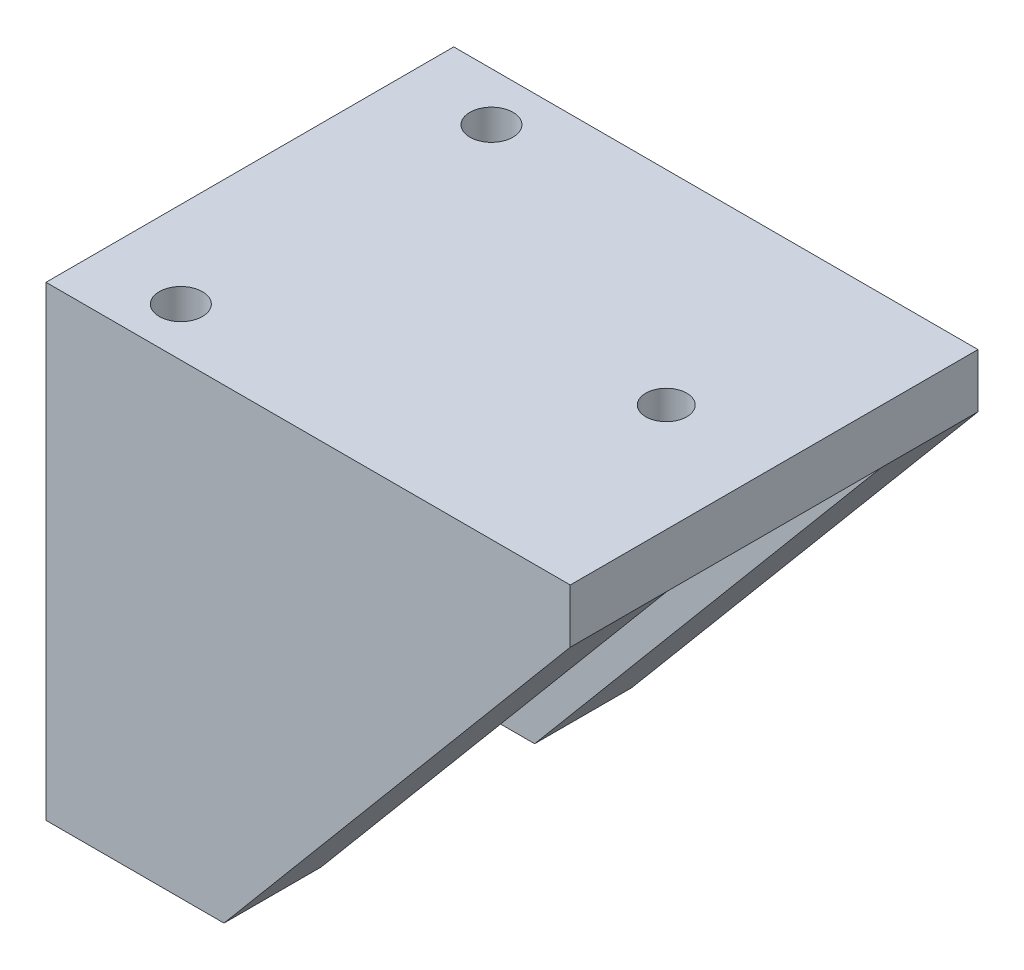
ISO-10303-21;
HEADER;
FILE_DESCRIPTION(('STEP AP214'),'2;1');
FILE_NAME('part.step','',(''),(''),'','','');
FILE_SCHEMA(('AUTOMOTIVE_DESIGN { 1 0 10303 214 1 1 1 1 }'));
ENDSEC;
DATA;
#1=APPLICATION_CONTEXT('core data for automotive mechanical design processes');
#2=APPLICATION_PROTOCOL_DEFINITION('international standard','automotive_design',2000,#1);
#3=PRODUCT_CONTEXT('',#1,'mechanical');
#4=PRODUCT('Part','Part','',(#3));
#5=PRODUCT_RELATED_PRODUCT_CATEGORY('part','',(#4));
#6=PRODUCT_DEFINITION_FORMATION('','',#4);
#7=PRODUCT_DEFINITION_CONTEXT('part definition',#1,'design');
#8=PRODUCT_DEFINITION('design','',#6,#7);
#9=PRODUCT_DEFINITION_SHAPE('','',#8);
#10=(LENGTH_UNIT() NAMED_UNIT(*) SI_UNIT(.MILLI.,.METRE.));
#11=(NAMED_UNIT(*) PLANE_ANGLE_UNIT() SI_UNIT($,.RADIAN.));
#12=(NAMED_UNIT(*) SI_UNIT($,.STERADIAN.) SOLID_ANGLE_UNIT());
#13=UNCERTAINTY_MEASURE_WITH_UNIT(LENGTH_MEASURE(1.E-05),#10,'distance_accuracy_value','');
#14=(GEOMETRIC_REPRESENTATION_CONTEXT(3) GLOBAL_UNCERTAINTY_ASSIGNED_CONTEXT((#13)) GLOBAL_UNIT_ASSIGNED_CONTEXT((#10,
#11,#12)) REPRESENTATION_CONTEXT('',''));
#15=CARTESIAN_POINT('',(0.,0.,0.));
#16=DIRECTION('',(0.,0.,1.));
#17=DIRECTION('',(1.,0.,0.));
#18=AXIS2_PLACEMENT_3D('',#15,#16,#17);
#19=CARTESIAN_POINT('',(-48.6730965518551,-8.5,28.8));
#20=DIRECTION('',(0.,1.,0.));
#21=DIRECTION('',(0.,0.,1.));
#22=AXIS2_PLACEMENT_3D('',#19,#20,#21);
#23=PLANE('',#22);
#24=CARTESIAN_POINT('',(-40.6730965518551,-8.5,-4.49576462355147));
#25=DIRECTION('',(0.,-1.,0.));
#26=DIRECTION('',(0.,0.,-1.));
#27=AXIS2_PLACEMENT_3D('',#24,#25,#26);
#28=CIRCLE('',#27,2.);
#29=CARTESIAN_POINT('',(-40.6730965518551,-8.5,-6.49576462355148));
#30=VERTEX_POINT('',#29);
#31=EDGE_CURVE('E254',#30,#30,#28,.T.);
#32=ORIENTED_EDGE('',*,*,#31,.F.);
#33=EDGE_LOOP('',(#32));
#34=FACE_BOUND('',#33,.T.);
#35=DIRECTION('',(-1.,0.,0.));
#36=VECTOR('',#35,1.);
#37=CARTESIAN_POINT('',(-32.1730965518551,-8.5,0.));
#38=LINE('',#37,#36);
#39=CARTESIAN_POINT('',(-32.1730965518551,-8.5,0.));
#40=VERTEX_POINT('',#39);
#41=CARTESIAN_POINT('',(-48.6730965518551,-8.5,0.));
#42=VERTEX_POINT('',#41);
#43=EDGE_CURVE('E124',#40,#42,#38,.T.);
#44=ORIENTED_EDGE('',*,*,#43,.T.);
#45=DIRECTION('',(0.,0.,-1.));
#46=VECTOR('',#45,1.);
#47=CARTESIAN_POINT('',(-48.6730965518551,-8.5,28.8));
#48=LINE('',#47,#46);
#49=CARTESIAN_POINT('',(-48.6730965518551,-8.5,-9.));
#50=VERTEX_POINT('',#49);
#51=EDGE_CURVE('E134',#42,#50,#48,.T.);
#52=ORIENTED_EDGE('',*,*,#51,.T.);
#53=DIRECTION('',(-1.,0.,0.));
#54=VECTOR('',#53,1.);
#55=CARTESIAN_POINT('',(-32.1730965518551,-8.5,-9.));
#56=LINE('',#55,#54);
#57=CARTESIAN_POINT('',(-32.1730965518551,-8.5,-9.));
#58=VERTEX_POINT('',#57);
#59=EDGE_CURVE('E224',#58,#50,#56,.T.);
#60=ORIENTED_EDGE('',*,*,#59,.F.);
#61=DIRECTION('',(0.,0.,1.));
#62=VECTOR('',#61,1.);
#63=CARTESIAN_POINT('',(-32.1730965518551,-8.5,-9.));
#64=LINE('',#63,#62);
#65=EDGE_CURVE('E137',#58,#40,#64,.T.);
#66=ORIENTED_EDGE('',*,*,#65,.T.);
#67=EDGE_LOOP('',(#44,#52,#60,#66));
#68=FACE_BOUND('',#67,.T.);
#69=ADVANCED_FACE('F34',(#34,#68),#23,.F.);
#70=CARTESIAN_POINT('',(0.,0.,19.8));
#71=DIRECTION('',(0.,0.,1.));
#72=DIRECTION('',(1.,0.,0.));
#73=AXIS2_PLACEMENT_3D('',#70,#71,#72);
#74=PLANE('',#73);
#75=DIRECTION('',(1.,0.,0.));
#76=VECTOR('',#75,1.);
#77=CARTESIAN_POINT('',(-48.6730965518551,-8.5,19.8));
#78=LINE('',#77,#76);
#79=CARTESIAN_POINT('',(-48.6730965518551,-8.5,19.8));
#80=VERTEX_POINT('',#79);
#81=CARTESIAN_POINT('',(-32.1730965518551,-8.5,19.8));
#82=VERTEX_POINT('',#81);
#83=EDGE_CURVE('E192',#80,#82,#78,.T.);
#84=ORIENTED_EDGE('',*,*,#83,.F.);
#85=DIRECTION('',(0.,-1.,0.));
#86=VECTOR('',#85,1.);
#87=CARTESIAN_POINT('',(-48.6730965518551,34.7,19.8));
#88=LINE('',#87,#86);
#89=CARTESIAN_POINT('',(-48.6730965518551,2.79999999999999,19.8));
#90=VERTEX_POINT('',#89);
#91=EDGE_CURVE('E190',#90,#80,#88,.T.);
#92=ORIENTED_EDGE('',*,*,#91,.F.);
#93=DIRECTION('',(1.,0.,0.));
#94=VECTOR('',#93,1.);
#95=CARTESIAN_POINT('',(-48.6730965518551,2.79999999999999,19.8));
#96=LINE('',#95,#94);
#97=CARTESIAN_POINT('',(-40.6730965518551,2.79999999999999,19.8));
#98=VERTEX_POINT('',#97);
#99=EDGE_CURVE('E152',#90,#98,#96,.T.);
#100=ORIENTED_EDGE('',*,*,#99,.T.);
#101=DIRECTION('',(0.,1.,0.));
#102=VECTOR('',#101,1.);
#103=CARTESIAN_POINT('',(-40.6730965518551,29.7,19.8));
#104=LINE('',#103,#102);
#105=CARTESIAN_POINT('',(-40.6730965518551,29.7,19.8));
#106=VERTEX_POINT('',#105);
#107=EDGE_CURVE('E155',#98,#106,#104,.T.);
#108=ORIENTED_EDGE('',*,*,#107,.T.);
#109=DIRECTION('',(1.,0.,0.));
#110=VECTOR('',#109,1.);
#111=CARTESIAN_POINT('',(-40.6730965518551,29.7,19.8));
#112=LINE('',#111,#110);
#113=CARTESIAN_POINT('',(-0.0730965518550564,29.7,19.8));
#114=VERTEX_POINT('',#113);
#115=EDGE_CURVE('E159',#106,#114,#112,.T.);
#116=ORIENTED_EDGE('',*,*,#115,.T.);
#117=DIRECTION('',(0.6433330806464,0.765586407498208,0.));
#118=VECTOR('',#117,1.);
#119=CARTESIAN_POINT('',(-0.0730965518550564,29.7,19.8));
#120=LINE('',#119,#118);
#121=EDGE_CURVE('E196',#82,#114,#120,.T.);
#122=ORIENTED_EDGE('',*,*,#121,.F.);
#123=EDGE_LOOP('',(#84,#92,#100,#108,#116,#122));
#124=FACE_BOUND('',#123,.T.);
#125=ADVANCED_FACE('F188',(#124),#74,.F.);
#126=CARTESIAN_POINT('',(-48.6730965518551,2.79999999999999,19.8));
#127=DIRECTION('',(1.,0.,0.));
#128=DIRECTION('',(0.,0.,-1.));
#129=AXIS2_PLACEMENT_3D('',#126,#127,#128);
#130=PLANE('',#129);
#131=ORIENTED_EDGE('',*,*,#51,.F.);
#132=DIRECTION('',(0.,1.,0.));
#133=VECTOR('',#132,1.);
#134=CARTESIAN_POINT('',(-48.6730965518551,-8.5,0.));
#135=LINE('',#134,#133);
#136=CARTESIAN_POINT('',(-48.6730965518551,2.79999999999999,0.));
#137=VERTEX_POINT('',#136);
#138=EDGE_CURVE('E120',#42,#137,#135,.T.);
#139=ORIENTED_EDGE('',*,*,#138,.T.);
#140=DIRECTION('',(0.,0.,-1.));
#141=VECTOR('',#140,1.);
#142=CARTESIAN_POINT('',(-48.6730965518551,2.79999999999999,19.8));
#143=LINE('',#142,#141);
#144=EDGE_CURVE('E174',#90,#137,#143,.T.);
#145=ORIENTED_EDGE('',*,*,#144,.F.);
#146=ORIENTED_EDGE('',*,*,#91,.T.);
#147=CARTESIAN_POINT('',(-48.6730965518551,-8.5,28.8));
#148=VERTEX_POINT('',#147);
#149=EDGE_CURVE('E143',#148,#80,#48,.T.);
#150=ORIENTED_EDGE('',*,*,#149,.F.);
#151=DIRECTION('',(0.,-1.,0.));
#152=VECTOR('',#151,1.);
#153=CARTESIAN_POINT('',(-48.6730965518551,34.7,28.8));
#154=LINE('',#153,#152);
#155=CARTESIAN_POINT('',(-48.6730965518551,34.7,28.8));
#156=VERTEX_POINT('',#155);
#157=EDGE_CURVE('E204',#156,#148,#154,.T.);
#158=ORIENTED_EDGE('',*,*,#157,.F.);
#159=DIRECTION('',(0.,0.,-1.));
#160=VECTOR('',#159,1.);
#161=CARTESIAN_POINT('',(-48.6730965518551,34.7,19.8));
#162=LINE('',#161,#160);
#163=CARTESIAN_POINT('',(-48.6730965518551,34.7,-9.));
#164=VERTEX_POINT('',#163);
#165=EDGE_CURVE('E176',#156,#164,#162,.T.);
#166=ORIENTED_EDGE('',*,*,#165,.T.);
#167=DIRECTION('',(0.,1.,0.));
#168=VECTOR('',#167,1.);
#169=CARTESIAN_POINT('',(-48.6730965518551,-8.5,-9.));
#170=LINE('',#169,#168);
#171=EDGE_CURVE('E141',#50,#164,#170,.T.);
#172=ORIENTED_EDGE('',*,*,#171,.F.);
#173=EDGE_LOOP('',(#131,#139,#145,#146,#150,#158,#166,#172));
#174=FACE_BOUND('',#173,.T.);
#175=ADVANCED_FACE('F36',(#174),#130,.F.);
#176=CARTESIAN_POINT('',(-48.6730965518551,2.79999999999999,19.8));
#177=DIRECTION('',(0.,1.,0.));
#178=DIRECTION('',(0.,0.,1.));
#179=AXIS2_PLACEMENT_3D('',#176,#177,#178);
#180=PLANE('',#179);
#181=CARTESIAN_POINT('',(-45.2730965518551,2.79999999999999,4.9));
#182=DIRECTION('',(0.,1.,0.));
#183=DIRECTION('',(0.,0.,1.));
#184=AXIS2_PLACEMENT_3D('',#181,#182,#183);
#185=CIRCLE('',#184,2.15);
#186=CARTESIAN_POINT('',(-45.2730965518551,2.79999999999999,7.05));
#187=VERTEX_POINT('',#186);
#188=EDGE_CURVE('E11',#187,#187,#185,.F.);
#189=ORIENTED_EDGE('',*,*,#188,.F.);
#190=EDGE_LOOP('',(#189));
#191=FACE_BOUND('',#190,.T.);
#192=CARTESIAN_POINT('',(-45.2730965518551,2.79999999999999,14.9));
#193=DIRECTION('',(0.,1.,0.));
#194=DIRECTION('',(0.,0.,1.));
#195=AXIS2_PLACEMENT_3D('',#192,#193,#194);
#196=CIRCLE('',#195,2.15);
#197=CARTESIAN_POINT('',(-45.2730965518551,2.79999999999999,17.05));
#198=VERTEX_POINT('',#197);
#199=EDGE_CURVE('E42',#198,#198,#196,.F.);
#200=ORIENTED_EDGE('',*,*,#199,.F.);
#201=EDGE_LOOP('',(#200));
#202=FACE_BOUND('',#201,.T.);
#203=DIRECTION('',(1.,0.,0.));
#204=VECTOR('',#203,1.);
#205=CARTESIAN_POINT('',(-48.6730965518551,2.79999999999999,0.));
#206=LINE('',#205,#204);
#207=CARTESIAN_POINT('',(-40.6730965518551,2.79999999999999,0.));
#208=VERTEX_POINT('',#207);
#209=EDGE_CURVE('E125',#137,#208,#206,.T.);
#210=ORIENTED_EDGE('',*,*,#209,.T.);
#211=DIRECTION('',(0.,0.,-1.));
#212=VECTOR('',#211,1.);
#213=CARTESIAN_POINT('',(-40.6730965518551,2.79999999999999,19.8));
#214=LINE('',#213,#212);
#215=EDGE_CURVE('E57',#98,#208,#214,.T.);
#216=ORIENTED_EDGE('',*,*,#215,.F.);
#217=ORIENTED_EDGE('',*,*,#99,.F.);
#218=ORIENTED_EDGE('',*,*,#144,.T.);
#219=EDGE_LOOP('',(#210,#216,#217,#218));
#220=FACE_BOUND('',#219,.T.);
#221=ADVANCED_FACE('F182',(#191,#202,#220),#180,.F.);
#222=CARTESIAN_POINT('',(-40.6730965518551,29.7,19.8));
#223=DIRECTION('',(-1.,0.,0.));
#224=DIRECTION('',(0.,0.,1.));
#225=AXIS2_PLACEMENT_3D('',#222,#223,#224);
#226=PLANE('',#225);
#227=DIRECTION('',(0.,1.,0.));
#228=VECTOR('',#227,1.);
#229=CARTESIAN_POINT('',(-40.6730965518551,29.7,0.));
#230=LINE('',#229,#228);
#231=CARTESIAN_POINT('',(-40.6730965518551,29.7,0.));
#232=VERTEX_POINT('',#231);
#233=EDGE_CURVE('E164',#208,#232,#230,.T.);
#234=ORIENTED_EDGE('',*,*,#233,.T.);
#235=DIRECTION('',(0.,0.,-1.));
#236=VECTOR('',#235,1.);
#237=CARTESIAN_POINT('',(-40.6730965518551,29.7,19.8));
#238=LINE('',#237,#236);
#239=EDGE_CURVE('E49',#106,#232,#238,.T.);
#240=ORIENTED_EDGE('',*,*,#239,.F.);
#241=ORIENTED_EDGE('',*,*,#107,.F.);
#242=ORIENTED_EDGE('',*,*,#215,.T.);
#243=EDGE_LOOP('',(#234,#240,#241,#242));
#244=FACE_BOUND('',#243,.T.);
#245=ADVANCED_FACE('F184',(#244),#226,.F.);
#246=CARTESIAN_POINT('',(-40.6730965518551,29.7,19.8));
#247=DIRECTION('',(0.,1.,0.));
#248=DIRECTION('',(0.,0.,1.));
#249=AXIS2_PLACEMENT_3D('',#246,#247,#248);
#250=PLANE('',#249);
#251=CARTESIAN_POINT('',(-10.0730965518551,29.7,9.9));
#252=DIRECTION('',(0.,1.,0.));
#253=DIRECTION('',(0.,0.,1.));
#254=AXIS2_PLACEMENT_3D('',#251,#252,#253);
#255=CIRCLE('',#254,1.9);
#256=CARTESIAN_POINT('',(-10.0730965518551,29.7,11.8));
#257=VERTEX_POINT('',#256);
#258=EDGE_CURVE('E138',#257,#257,#255,.F.);
#259=ORIENTED_EDGE('',*,*,#258,.F.);
#260=EDGE_LOOP('',(#259));
#261=FACE_BOUND('',#260,.T.);
#262=DIRECTION('',(1.,0.,0.));
#263=VECTOR('',#262,1.);
#264=CARTESIAN_POINT('',(-40.6730965518551,29.7,0.));
#265=LINE('',#264,#263);
#266=CARTESIAN_POINT('',(-0.0730965518550564,29.7,0.));
#267=VERTEX_POINT('',#266);
#268=EDGE_CURVE('E156',#232,#267,#265,.T.);
#269=ORIENTED_EDGE('',*,*,#268,.T.);
#270=DIRECTION('',(0.,0.,-1.));
#271=VECTOR('',#270,1.);
#272=CARTESIAN_POINT('',(-0.0730965518550564,29.7,19.8));
#273=LINE('',#272,#271);
#274=EDGE_CURVE('E169',#114,#267,#273,.T.);
#275=ORIENTED_EDGE('',*,*,#274,.F.);
#276=ORIENTED_EDGE('',*,*,#115,.F.);
#277=ORIENTED_EDGE('',*,*,#239,.T.);
#278=EDGE_LOOP('',(#269,#275,#276,#277));
#279=FACE_BOUND('',#278,.T.);
#280=ADVANCED_FACE('F296',(#261,#279),#250,.F.);
#281=CARTESIAN_POINT('',(-0.0730965518550564,34.7,19.8));
#282=DIRECTION('',(-1.,0.,0.));
#283=DIRECTION('',(0.,0.,1.));
#284=AXIS2_PLACEMENT_3D('',#281,#282,#283);
#285=PLANE('',#284);
#286=ORIENTED_EDGE('',*,*,#274,.T.);
#287=DIRECTION('',(0.,0.,1.));
#288=VECTOR('',#287,1.);
#289=CARTESIAN_POINT('',(-0.0730965518550564,29.7,-9.));
#290=LINE('',#289,#288);
#291=CARTESIAN_POINT('',(-0.0730965518550564,29.7,-9.));
#292=VERTEX_POINT('',#291);
#293=EDGE_CURVE('E194',#292,#267,#290,.T.);
#294=ORIENTED_EDGE('',*,*,#293,.F.);
#295=DIRECTION('',(0.,-1.,0.));
#296=VECTOR('',#295,1.);
#297=CARTESIAN_POINT('',(-0.0730965518550564,34.7,-9.));
#298=LINE('',#297,#296);
#299=CARTESIAN_POINT('',(-0.0730965518550564,34.7,-9.));
#300=VERTEX_POINT('',#299);
#301=EDGE_CURVE('E227',#300,#292,#298,.T.);
#302=ORIENTED_EDGE('',*,*,#301,.F.);
#303=DIRECTION('',(0.,0.,-1.));
#304=VECTOR('',#303,1.);
#305=CARTESIAN_POINT('',(-0.0730965518550564,34.7,19.8));
#306=LINE('',#305,#304);
#307=CARTESIAN_POINT('',(-0.0730965518550564,34.7,28.8));
#308=VERTEX_POINT('',#307);
#309=EDGE_CURVE('E162',#308,#300,#306,.T.);
#310=ORIENTED_EDGE('',*,*,#309,.F.);
#311=DIRECTION('',(0.,1.,0.));
#312=VECTOR('',#311,1.);
#313=CARTESIAN_POINT('',(-0.0730965518550564,34.7,28.8));
#314=LINE('',#313,#312);
#315=CARTESIAN_POINT('',(-0.0730965518550564,29.7,28.8));
#316=VERTEX_POINT('',#315);
#317=EDGE_CURVE('E210',#316,#308,#314,.T.);
#318=ORIENTED_EDGE('',*,*,#317,.F.);
#319=DIRECTION('',(0.,0.,-1.));
#320=VECTOR('',#319,1.);
#321=CARTESIAN_POINT('',(-0.0730965518550564,29.7,28.8));
#322=LINE('',#321,#320);
#323=EDGE_CURVE('E148',#316,#114,#322,.T.);
#324=ORIENTED_EDGE('',*,*,#323,.T.);
#325=EDGE_LOOP('',(#286,#294,#302,#310,#318,#324));
#326=FACE_BOUND('',#325,.T.);
#327=ADVANCED_FACE('F280',(#326),#285,.F.);
#328=CARTESIAN_POINT('',(-41.6730965518551,34.7,19.8));
#329=DIRECTION('',(0.,-1.,0.));
#330=DIRECTION('',(0.,0.,-1.));
#331=AXIS2_PLACEMENT_3D('',#328,#329,#330);
#332=PLANE('',#331);
#333=CARTESIAN_POINT('',(-40.6730965518551,34.7,-4.49576462355147));
#334=DIRECTION('',(0.,-1.,0.));
#335=DIRECTION('',(0.,0.,-1.));
#336=AXIS2_PLACEMENT_3D('',#333,#334,#335);
#337=CIRCLE('',#336,2.);
#338=CARTESIAN_POINT('',(-40.6730965518551,34.7,-6.49576462355148));
#339=VERTEX_POINT('',#338);
#340=EDGE_CURVE('E251',#339,#339,#337,.F.);
#341=ORIENTED_EDGE('',*,*,#340,.F.);
#342=EDGE_LOOP('',(#341));
#343=FACE_BOUND('',#342,.T.);
#344=CARTESIAN_POINT('',(-40.6730965518551,34.7,24.3));
#345=DIRECTION('',(0.,-1.,0.));
#346=DIRECTION('',(0.,0.,-1.));
#347=AXIS2_PLACEMENT_3D('',#344,#345,#346);
#348=CIRCLE('',#347,2.);
#349=CARTESIAN_POINT('',(-40.6730965518551,34.7,22.3));
#350=VERTEX_POINT('',#349);
#351=EDGE_CURVE('E245',#350,#350,#348,.F.);
#352=ORIENTED_EDGE('',*,*,#351,.F.);
#353=EDGE_LOOP('',(#352));
#354=FACE_BOUND('',#353,.T.);
#355=CARTESIAN_POINT('',(-10.0730965518551,34.7,9.9));
#356=DIRECTION('',(0.,1.,0.));
#357=DIRECTION('',(0.,0.,1.));
#358=AXIS2_PLACEMENT_3D('',#355,#356,#357);
#359=CIRCLE('',#358,1.9);
#360=CARTESIAN_POINT('',(-10.0730965518551,34.7,11.8));
#361=VERTEX_POINT('',#360);
#362=EDGE_CURVE('E236',#361,#361,#359,.T.);
#363=ORIENTED_EDGE('',*,*,#362,.F.);
#364=EDGE_LOOP('',(#363));
#365=FACE_BOUND('',#364,.T.);
#366=ORIENTED_EDGE('',*,*,#309,.T.);
#367=DIRECTION('',(1.,0.,0.));
#368=VECTOR('',#367,1.);
#369=CARTESIAN_POINT('',(-48.6730965518551,34.7,-9.));
#370=LINE('',#369,#368);
#371=EDGE_CURVE('E229',#164,#300,#370,.T.);
#372=ORIENTED_EDGE('',*,*,#371,.F.);
#373=ORIENTED_EDGE('',*,*,#165,.F.);
#374=DIRECTION('',(-1.,0.,0.));
#375=VECTOR('',#374,1.);
#376=CARTESIAN_POINT('',(-0.0730965518550564,34.7,28.8));
#377=LINE('',#376,#375);
#378=EDGE_CURVE('E200',#308,#156,#377,.T.);
#379=ORIENTED_EDGE('',*,*,#378,.F.);
#380=EDGE_LOOP('',(#366,#372,#373,#379));
#381=FACE_BOUND('',#380,.T.);
#382=ADVANCED_FACE('F272',(#343,#354,#365,#381),#332,.F.);
#383=CARTESIAN_POINT('',(-40.6730965518551,-8.5,24.3));
#384=DIRECTION('',(0.,-1.,0.));
#385=DIRECTION('',(0.,0.,-1.));
#386=AXIS2_PLACEMENT_3D('',#383,#384,#385);
#387=CIRCLE('',#386,2.);
#388=CARTESIAN_POINT('',(-40.6730965518551,-8.5,22.3));
#389=VERTEX_POINT('',#388);
#390=EDGE_CURVE('E248',#389,#389,#387,.T.);
#391=ORIENTED_EDGE('',*,*,#390,.F.);
#392=EDGE_LOOP('',(#391));
#393=FACE_BOUND('',#392,.T.);
#394=ORIENTED_EDGE('',*,*,#149,.T.);
#395=ORIENTED_EDGE('',*,*,#83,.T.);
#396=DIRECTION('',(0.,0.,-1.));
#397=VECTOR('',#396,1.);
#398=CARTESIAN_POINT('',(-32.1730965518551,-8.5,28.8));
#399=LINE('',#398,#397);
#400=CARTESIAN_POINT('',(-32.1730965518551,-8.5,28.8));
#401=VERTEX_POINT('',#400);
#402=EDGE_CURVE('E144',#401,#82,#399,.T.);
#403=ORIENTED_EDGE('',*,*,#402,.F.);
#404=DIRECTION('',(1.,0.,0.));
#405=VECTOR('',#404,1.);
#406=CARTESIAN_POINT('',(-48.6730965518551,-8.5,28.8));
#407=LINE('',#406,#405);
#408=EDGE_CURVE('E217',#148,#401,#407,.T.);
#409=ORIENTED_EDGE('',*,*,#408,.F.);
#410=EDGE_LOOP('',(#394,#395,#403,#409));
#411=FACE_BOUND('',#410,.T.);
#412=ADVANCED_FACE('F263',(#393,#411),#23,.F.);
#413=CARTESIAN_POINT('',(-0.0730965518550564,29.7,28.8));
#414=DIRECTION('',(-0.765586407498208,0.6433330806464,0.));
#415=DIRECTION('',(-0.6433330806464,-0.765586407498208,0.));
#416=AXIS2_PLACEMENT_3D('',#413,#414,#415);
#417=PLANE('',#416);
#418=ORIENTED_EDGE('',*,*,#121,.T.);
#419=ORIENTED_EDGE('',*,*,#323,.F.);
#420=DIRECTION('',(0.6433330806464,0.765586407498208,0.));
#421=VECTOR('',#420,1.);
#422=CARTESIAN_POINT('',(-0.0730965518550564,29.7,28.8));
#423=LINE('',#422,#421);
#424=EDGE_CURVE('E216',#401,#316,#423,.T.);
#425=ORIENTED_EDGE('',*,*,#424,.F.);
#426=ORIENTED_EDGE('',*,*,#402,.T.);
#427=EDGE_LOOP('',(#418,#419,#425,#426));
#428=FACE_BOUND('',#427,.T.);
#429=ADVANCED_FACE('F271',(#428),#417,.F.);
#430=CARTESIAN_POINT('',(0.,0.,28.8));
#431=DIRECTION('',(0.,0.,1.));
#432=DIRECTION('',(1.,0.,0.));
#433=AXIS2_PLACEMENT_3D('',#430,#431,#432);
#434=PLANE('',#433);
#435=ORIENTED_EDGE('',*,*,#157,.T.);
#436=ORIENTED_EDGE('',*,*,#408,.T.);
#437=ORIENTED_EDGE('',*,*,#424,.T.);
#438=ORIENTED_EDGE('',*,*,#317,.T.);
#439=ORIENTED_EDGE('',*,*,#378,.T.);
#440=EDGE_LOOP('',(#435,#436,#437,#438,#439));
#441=FACE_BOUND('',#440,.T.);
#442=ADVANCED_FACE('F278',(#441),#434,.T.);
#443=CARTESIAN_POINT('',(0.,0.,0.));
#444=DIRECTION('',(0.,0.,-1.));
#445=DIRECTION('',(-1.,0.,0.));
#446=AXIS2_PLACEMENT_3D('',#443,#444,#445);
#447=PLANE('',#446);
#448=ORIENTED_EDGE('',*,*,#138,.F.);
#449=ORIENTED_EDGE('',*,*,#43,.F.);
#450=DIRECTION('',(-0.6433330806464,-0.765586407498208,0.));
#451=VECTOR('',#450,1.);
#452=CARTESIAN_POINT('',(-0.0730965518550564,29.7,0.));
#453=LINE('',#452,#451);
#454=EDGE_CURVE('E129',#267,#40,#453,.T.);
#455=ORIENTED_EDGE('',*,*,#454,.F.);
#456=ORIENTED_EDGE('',*,*,#268,.F.);
#457=ORIENTED_EDGE('',*,*,#233,.F.);
#458=ORIENTED_EDGE('',*,*,#209,.F.);
#459=EDGE_LOOP('',(#448,#449,#455,#456,#457,#458));
#460=FACE_BOUND('',#459,.T.);
#461=ADVANCED_FACE('F122',(#460),#447,.F.);
#462=CARTESIAN_POINT('',(-0.0730965518550564,29.7,-9.));
#463=DIRECTION('',(-0.765586407498208,0.6433330806464,0.));
#464=DIRECTION('',(-0.6433330806464,-0.765586407498208,0.));
#465=AXIS2_PLACEMENT_3D('',#462,#463,#464);
#466=PLANE('',#465);
#467=ORIENTED_EDGE('',*,*,#454,.T.);
#468=ORIENTED_EDGE('',*,*,#65,.F.);
#469=DIRECTION('',(-0.6433330806464,-0.765586407498208,0.));
#470=VECTOR('',#469,1.);
#471=CARTESIAN_POINT('',(-0.0730965518550564,29.7,-9.));
#472=LINE('',#471,#470);
#473=EDGE_CURVE('E223',#292,#58,#472,.T.);
#474=ORIENTED_EDGE('',*,*,#473,.F.);
#475=ORIENTED_EDGE('',*,*,#293,.T.);
#476=EDGE_LOOP('',(#467,#468,#474,#475));
#477=FACE_BOUND('',#476,.T.);
#478=ADVANCED_FACE('F294',(#477),#466,.F.);
#479=CARTESIAN_POINT('',(0.,0.,-9.));
#480=DIRECTION('',(0.,0.,-1.));
#481=DIRECTION('',(-1.,0.,0.));
#482=AXIS2_PLACEMENT_3D('',#479,#480,#481);
#483=PLANE('',#482);
#484=ORIENTED_EDGE('',*,*,#59,.T.);
#485=ORIENTED_EDGE('',*,*,#171,.T.);
#486=ORIENTED_EDGE('',*,*,#371,.T.);
#487=ORIENTED_EDGE('',*,*,#301,.T.);
#488=ORIENTED_EDGE('',*,*,#473,.T.);
#489=EDGE_LOOP('',(#484,#485,#486,#487,#488));
#490=FACE_BOUND('',#489,.T.);
#491=ADVANCED_FACE('F291',(#490),#483,.T.);
#492=CARTESIAN_POINT('',(-10.0730965518551,-8.50100000000001,9.9));
#493=DIRECTION('',(0.,1.,0.));
#494=DIRECTION('',(0.,0.,1.));
#495=AXIS2_PLACEMENT_3D('',#492,#493,#494);
#496=CYLINDRICAL_SURFACE('',#495,1.9);
#497=ORIENTED_EDGE('',*,*,#362,.T.);
#498=EDGE_LOOP('',(#497));
#499=FACE_BOUND('',#498,.T.);
#500=ORIENTED_EDGE('',*,*,#258,.T.);
#501=EDGE_LOOP('',(#500));
#502=FACE_BOUND('',#501,.T.);
#503=ADVANCED_FACE('F308',(#499,#502),#496,.F.);
#504=CARTESIAN_POINT('',(-45.2730965518551,-2.20000000000001,14.9));
#505=DIRECTION('',(0.,1.,0.));
#506=DIRECTION('',(0.,0.,1.));
#507=AXIS2_PLACEMENT_3D('',#504,#505,#506);
#508=CYLINDRICAL_SURFACE('',#507,2.15);
#509=CARTESIAN_POINT('',(-45.2730965518551,-2.20000000000001,14.9));
#510=DIRECTION('',(0.,-1.,0.));
#511=DIRECTION('',(0.,0.,-1.));
#512=AXIS2_PLACEMENT_3D('',#509,#510,#511);
#513=CIRCLE('',#512,2.15);
#514=CARTESIAN_POINT('',(-45.2730965518551,-2.20000000000001,12.75));
#515=VERTEX_POINT('',#514);
#516=EDGE_CURVE('E239',#515,#515,#513,.T.);
#517=ORIENTED_EDGE('',*,*,#516,.F.);
#518=EDGE_LOOP('',(#517));
#519=FACE_BOUND('',#518,.T.);
#520=ORIENTED_EDGE('',*,*,#199,.T.);
#521=EDGE_LOOP('',(#520));
#522=FACE_BOUND('',#521,.T.);
#523=ADVANCED_FACE('F180',(#519,#522),#508,.T.);
#524=CARTESIAN_POINT('',(-45.2730965518551,-2.20000000000001,14.9));
#525=DIRECTION('',(0.,-1.,0.));
#526=DIRECTION('',(0.,0.,-1.));
#527=AXIS2_PLACEMENT_3D('',#524,#525,#526);
#528=PLANE('',#527);
#529=ORIENTED_EDGE('',*,*,#516,.T.);
#530=EDGE_LOOP('',(#529));
#531=FACE_BOUND('',#530,.T.);
#532=ADVANCED_FACE('F316',(#531),#528,.T.);
#533=CARTESIAN_POINT('',(-45.2730965518551,-2.20000000000001,4.9));
#534=DIRECTION('',(0.,1.,0.));
#535=DIRECTION('',(0.,0.,1.));
#536=AXIS2_PLACEMENT_3D('',#533,#534,#535);
#537=CYLINDRICAL_SURFACE('',#536,2.15);
#538=CARTESIAN_POINT('',(-45.2730965518551,-2.20000000000001,4.9));
#539=DIRECTION('',(0.,-1.,0.));
#540=DIRECTION('',(0.,0.,-1.));
#541=AXIS2_PLACEMENT_3D('',#538,#539,#540);
#542=CIRCLE('',#541,2.15);
#543=CARTESIAN_POINT('',(-45.2730965518551,-2.20000000000001,2.75));
#544=VERTEX_POINT('',#543);
#545=EDGE_CURVE('E242',#544,#544,#542,.T.);
#546=ORIENTED_EDGE('',*,*,#545,.F.);
#547=EDGE_LOOP('',(#546));
#548=FACE_BOUND('',#547,.T.);
#549=ORIENTED_EDGE('',*,*,#188,.T.);
#550=EDGE_LOOP('',(#549));
#551=FACE_BOUND('',#550,.T.);
#552=ADVANCED_FACE('F430',(#548,#551),#537,.T.);
#553=CARTESIAN_POINT('',(-45.2730965518551,-2.20000000000001,4.9));
#554=DIRECTION('',(0.,-1.,0.));
#555=DIRECTION('',(0.,0.,-1.));
#556=AXIS2_PLACEMENT_3D('',#553,#554,#555);
#557=PLANE('',#556);
#558=ORIENTED_EDGE('',*,*,#545,.T.);
#559=EDGE_LOOP('',(#558));
#560=FACE_BOUND('',#559,.T.);
#561=ADVANCED_FACE('F413',(#560),#557,.T.);
#562=CARTESIAN_POINT('',(-40.6730965518551,34.701,24.3));
#563=DIRECTION('',(0.,-1.,0.));
#564=DIRECTION('',(0.,0.,-1.));
#565=AXIS2_PLACEMENT_3D('',#562,#563,#564);
#566=CYLINDRICAL_SURFACE('',#565,2.);
#567=ORIENTED_EDGE('',*,*,#390,.T.);
#568=EDGE_LOOP('',(#567));
#569=FACE_BOUND('',#568,.T.);
#570=ORIENTED_EDGE('',*,*,#351,.T.);
#571=EDGE_LOOP('',(#570));
#572=FACE_BOUND('',#571,.T.);
#573=ADVANCED_FACE('F408',(#569,#572),#566,.F.);
#574=CARTESIAN_POINT('',(-40.6730965518551,34.701,-4.49576462355147));
#575=DIRECTION('',(0.,-1.,0.));
#576=DIRECTION('',(0.,0.,-1.));
#577=AXIS2_PLACEMENT_3D('',#574,#575,#576);
#578=CYLINDRICAL_SURFACE('',#577,2.);
#579=ORIENTED_EDGE('',*,*,#31,.T.);
#580=EDGE_LOOP('',(#579));
#581=FACE_BOUND('',#580,.T.);
#582=ORIENTED_EDGE('',*,*,#340,.T.);
#583=EDGE_LOOP('',(#582));
#584=FACE_BOUND('',#583,.T.);
#585=ADVANCED_FACE('F258',(#581,#584),#578,.F.);
#586=CLOSED_SHELL('',(#69,#125,#175,#221,#245,#280,#327,#382,#412,#429,#442,#461,#478,#491,#503,
#523,#532,#552,#561,#573,#585));
#587=MANIFOLD_SOLID_BREP('B2',#586);
#588=ADVANCED_BREP_SHAPE_REPRESENTATION('',(#18,#587),#14);
#589=SHAPE_DEFINITION_REPRESENTATION(#9,#588);
ENDSEC;
END-ISO-10303-21;
